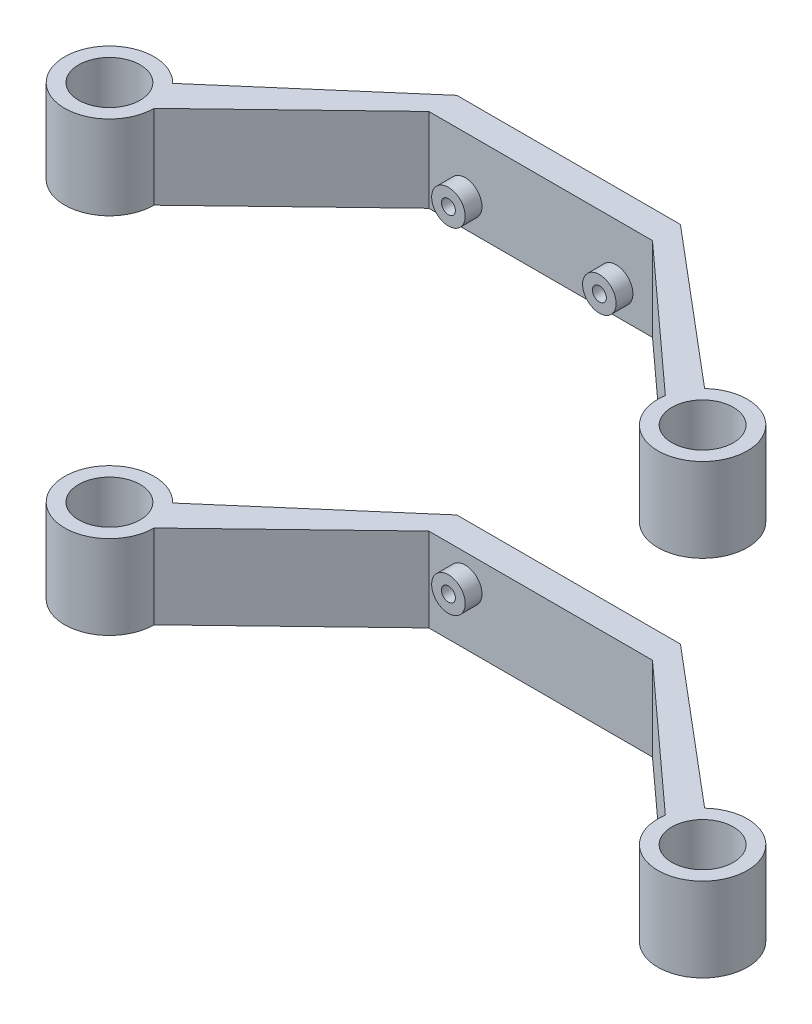
ISO-10303-21;
HEADER;
FILE_DESCRIPTION(('STEP AP214'),'2;1');
FILE_NAME('part.step','',(''),(''),'','','');
FILE_SCHEMA(('AUTOMOTIVE_DESIGN { 1 0 10303 214 1 1 1 1 }'));
ENDSEC;
DATA;
#1=APPLICATION_CONTEXT('core data for automotive mechanical design processes');
#2=APPLICATION_PROTOCOL_DEFINITION('international standard','automotive_design',2000,#1);
#3=PRODUCT_CONTEXT('',#1,'mechanical');
#4=PRODUCT('Part','Part','',(#3));
#5=PRODUCT_RELATED_PRODUCT_CATEGORY('part','',(#4));
#6=PRODUCT_DEFINITION_FORMATION('','',#4);
#7=PRODUCT_DEFINITION_CONTEXT('part definition',#1,'design');
#8=PRODUCT_DEFINITION('design','',#6,#7);
#9=PRODUCT_DEFINITION_SHAPE('','',#8);
#10=(LENGTH_UNIT() NAMED_UNIT(*) SI_UNIT(.MILLI.,.METRE.));
#11=(NAMED_UNIT(*) PLANE_ANGLE_UNIT() SI_UNIT($,.RADIAN.));
#12=(NAMED_UNIT(*) SI_UNIT($,.STERADIAN.) SOLID_ANGLE_UNIT());
#13=UNCERTAINTY_MEASURE_WITH_UNIT(LENGTH_MEASURE(1.E-05),#10,'distance_accuracy_value','');
#14=(GEOMETRIC_REPRESENTATION_CONTEXT(3) GLOBAL_UNCERTAINTY_ASSIGNED_CONTEXT((#13)) GLOBAL_UNIT_ASSIGNED_CONTEXT((#10,
#11,#12)) REPRESENTATION_CONTEXT('',''));
#15=CARTESIAN_POINT('',(0.,0.,0.));
#16=DIRECTION('',(0.,0.,1.));
#17=DIRECTION('',(1.,0.,0.));
#18=AXIS2_PLACEMENT_3D('',#15,#16,#17);
#19=CARTESIAN_POINT('',(0.,0.,0.));
#20=DIRECTION('',(0.,0.,1.));
#21=DIRECTION('',(1.,0.,0.));
#22=AXIS2_PLACEMENT_3D('',#19,#20,#21);
#23=PLANE('',#22);
#24=DIRECTION('',(0.,-1.,0.));
#25=VECTOR('',#24,1.);
#26=CARTESIAN_POINT('',(40.,0.,0.));
#27=LINE('',#26,#25);
#28=CARTESIAN_POINT('',(40.,0.,0.));
#29=VERTEX_POINT('',#28);
#30=CARTESIAN_POINT('',(40.,-15.,0.));
#31=VERTEX_POINT('',#30);
#32=EDGE_CURVE('E166',#29,#31,#27,.T.);
#33=ORIENTED_EDGE('',*,*,#32,.T.);
#34=DIRECTION('',(-1.,0.,0.));
#35=VECTOR('',#34,1.);
#36=CARTESIAN_POINT('',(-7.2392071826536,-15.,0.));
#37=LINE('',#36,#35);
#38=CARTESIAN_POINT('',(0.,-15.,0.));
#39=VERTEX_POINT('',#38);
#40=EDGE_CURVE('E90',#31,#39,#37,.T.);
#41=ORIENTED_EDGE('',*,*,#40,.T.);
#42=DIRECTION('',(0.,-1.,0.));
#43=VECTOR('',#42,1.);
#44=CARTESIAN_POINT('',(0.,0.,0.));
#45=LINE('',#44,#43);
#46=CARTESIAN_POINT('',(0.,0.,0.));
#47=VERTEX_POINT('',#46);
#48=EDGE_CURVE('E238',#47,#39,#45,.T.);
#49=ORIENTED_EDGE('',*,*,#48,.F.);
#50=DIRECTION('',(1.,0.,0.));
#51=VECTOR('',#50,1.);
#52=CARTESIAN_POINT('',(0.,0.,0.));
#53=LINE('',#52,#51);
#54=EDGE_CURVE('E224',#47,#29,#53,.T.);
#55=ORIENTED_EDGE('',*,*,#54,.T.);
#56=EDGE_LOOP('',(#33,#41,#49,#55));
#57=FACE_BOUND('',#56,.T.);
#58=ADVANCED_FACE('F87',(#57),#23,.F.);
#59=CARTESIAN_POINT('',(0.,-15.,0.));
#60=DIRECTION('',(0.,1.,0.));
#61=DIRECTION('',(0.,0.,1.));
#62=AXIS2_PLACEMENT_3D('',#59,#60,#61);
#63=PLANE('',#62);
#64=DIRECTION('',(-1.,0.,0.));
#65=VECTOR('',#64,1.);
#66=CARTESIAN_POINT('',(0.,-15.,5.00000000000001));
#67=LINE('',#66,#65);
#68=CARTESIAN_POINT('',(40.,-15.,5.));
#69=VERTEX_POINT('',#68);
#70=CARTESIAN_POINT('',(0.,-15.,5.00000000000002));
#71=VERTEX_POINT('',#70);
#72=EDGE_CURVE('E214',#69,#71,#67,.T.);
#73=ORIENTED_EDGE('',*,*,#72,.T.);
#74=DIRECTION('',(0.720883739402727,0.,-0.693056010914516));
#75=VECTOR('',#74,1.);
#76=CARTESIAN_POINT('',(2.49806404381797,-15.,2.5983668286763));
#77=LINE('',#76,#75);
#78=CARTESIAN_POINT('',(-25.05,-15.,29.0830138404742));
#79=VERTEX_POINT('',#78);
#80=EDGE_CURVE('E225',#79,#71,#77,.T.);
#81=ORIENTED_EDGE('',*,*,#80,.F.);
#82=CARTESIAN_POINT('',(-33.05,-15.,29.0830138404742));
#83=DIRECTION('',(0.,1.,0.));
#84=DIRECTION('',(0.,0.,1.));
#85=AXIS2_PLACEMENT_3D('',#82,#83,#84);
#86=CIRCLE('',#85,7.99999999999999);
#87=CARTESIAN_POINT('',(-27.2638611079006,-15.,23.5584689070579));
#88=VERTEX_POINT('',#87);
#89=EDGE_CURVE('E231',#88,#79,#86,.T.);
#90=ORIENTED_EDGE('',*,*,#89,.F.);
#91=DIRECTION('',(-0.756652649778043,0.,0.653817075017061));
#92=VECTOR('',#91,1.);
#93=CARTESIAN_POINT('',(0.,-15.,0.));
#94=LINE('',#93,#92);
#95=EDGE_CURVE('E236',#39,#88,#94,.T.);
#96=ORIENTED_EDGE('',*,*,#95,.F.);
#97=ORIENTED_EDGE('',*,*,#40,.F.);
#98=DIRECTION('',(-0.764521282063486,0.,-0.644598486867603));
#99=VECTOR('',#98,1.);
#100=CARTESIAN_POINT('',(16.6202883708801,-15.,-19.7123704638481));
#101=LINE('',#100,#99);
#102=CARTESIAN_POINT('',(67.5752167610798,-15.,23.2497687327456));
#103=VERTEX_POINT('',#102);
#104=EDGE_CURVE('E161',#103,#31,#101,.T.);
#105=ORIENTED_EDGE('',*,*,#104,.F.);
#106=CARTESIAN_POINT('',(73.05,-15.,29.0830138404742));
#107=DIRECTION('',(0.,1.,0.));
#108=DIRECTION('',(0.,0.,1.));
#109=AXIS2_PLACEMENT_3D('',#106,#107,#108);
#110=CIRCLE('',#109,8.00000000000001);
#111=CARTESIAN_POINT('',(65.1461266020736,-15.,27.8465732597946));
#112=VERTEX_POINT('',#111);
#113=EDGE_CURVE('E157',#112,#103,#110,.T.);
#114=ORIENTED_EDGE('',*,*,#113,.F.);
#115=DIRECTION('',(0.740138431190022,0.,0.672454535768459));
#116=VECTOR('',#115,1.);
#117=CARTESIAN_POINT('',(15.5992568812715,-15.,-17.1693533193891));
#118=LINE('',#117,#116);
#119=EDGE_CURVE('E218',#69,#112,#118,.T.);
#120=ORIENTED_EDGE('',*,*,#119,.F.);
#121=EDGE_LOOP('',(#73,#81,#90,#96,#97,#105,#114,#120));
#122=FACE_BOUND('',#121,.T.);
#123=CARTESIAN_POINT('',(73.05,-15.,29.0830138404742));
#124=DIRECTION('',(0.,1.,0.));
#125=DIRECTION('',(0.,0.,1.));
#126=AXIS2_PLACEMENT_3D('',#123,#124,#125);
#127=CIRCLE('',#126,5.5);
#128=CARTESIAN_POINT('',(73.05,-15.,34.5830138404742));
#129=VERTEX_POINT('',#128);
#130=EDGE_CURVE('E206',#129,#129,#127,.T.);
#131=ORIENTED_EDGE('',*,*,#130,.T.);
#132=EDGE_LOOP('',(#131));
#133=FACE_BOUND('',#132,.T.);
#134=CARTESIAN_POINT('',(-33.05,-15.,29.0830138404742));
#135=DIRECTION('',(0.,1.,0.));
#136=DIRECTION('',(0.,0.,1.));
#137=AXIS2_PLACEMENT_3D('',#134,#135,#136);
#138=CIRCLE('',#137,5.5);
#139=CARTESIAN_POINT('',(-33.05,-15.,34.5830138404742));
#140=VERTEX_POINT('',#139);
#141=EDGE_CURVE('E204',#140,#140,#138,.T.);
#142=ORIENTED_EDGE('',*,*,#141,.T.);
#143=EDGE_LOOP('',(#142));
#144=FACE_BOUND('',#143,.T.);
#145=ADVANCED_FACE('F242',(#122,#133,#144),#63,.F.);
#146=CARTESIAN_POINT('',(0.,0.,3.));
#147=DIRECTION('',(0.,1.,0.));
#148=DIRECTION('',(0.,0.,1.));
#149=AXIS2_PLACEMENT_3D('',#146,#147,#148);
#150=PLANE('',#149);
#151=ORIENTED_EDGE('',*,*,#54,.F.);
#152=DIRECTION('',(-0.756652649778043,0.,0.653817075017061));
#153=VECTOR('',#152,1.);
#154=CARTESIAN_POINT('',(0.,0.,0.));
#155=LINE('',#154,#153);
#156=CARTESIAN_POINT('',(-27.2638611079006,0.,23.5584689070579));
#157=VERTEX_POINT('',#156);
#158=EDGE_CURVE('E201',#47,#157,#155,.T.);
#159=ORIENTED_EDGE('',*,*,#158,.T.);
#160=CARTESIAN_POINT('',(-33.05,0.,29.0830138404742));
#161=DIRECTION('',(0.,1.,0.));
#162=DIRECTION('',(0.,0.,1.));
#163=AXIS2_PLACEMENT_3D('',#160,#161,#162);
#164=CIRCLE('',#163,7.99999999999999);
#165=CARTESIAN_POINT('',(-25.05,0.,29.0830138404742));
#166=VERTEX_POINT('',#165);
#167=EDGE_CURVE('E197',#157,#166,#164,.T.);
#168=ORIENTED_EDGE('',*,*,#167,.T.);
#169=DIRECTION('',(0.720883739402727,0.,-0.693056010914516));
#170=VECTOR('',#169,1.);
#171=CARTESIAN_POINT('',(2.49806404381797,0.,2.5983668286763));
#172=LINE('',#171,#170);
#173=CARTESIAN_POINT('',(0.,0.,5.00000000000002));
#174=VERTEX_POINT('',#173);
#175=EDGE_CURVE('E182',#166,#174,#172,.T.);
#176=ORIENTED_EDGE('',*,*,#175,.T.);
#177=DIRECTION('',(-1.,0.,0.));
#178=VECTOR('',#177,1.);
#179=CARTESIAN_POINT('',(0.,0.,5.00000000000001));
#180=LINE('',#179,#178);
#181=CARTESIAN_POINT('',(40.,0.,5.));
#182=VERTEX_POINT('',#181);
#183=EDGE_CURVE('E188',#182,#174,#180,.T.);
#184=ORIENTED_EDGE('',*,*,#183,.F.);
#185=DIRECTION('',(0.740138431190022,0.,0.672454535768459));
#186=VECTOR('',#185,1.);
#187=CARTESIAN_POINT('',(15.5992568812715,0.,-17.1693533193891));
#188=LINE('',#187,#186);
#189=CARTESIAN_POINT('',(65.1461266020736,0.,27.8465732597946));
#190=VERTEX_POINT('',#189);
#191=EDGE_CURVE('E178',#182,#190,#188,.T.);
#192=ORIENTED_EDGE('',*,*,#191,.T.);
#193=CARTESIAN_POINT('',(73.05,0.,29.0830138404742));
#194=DIRECTION('',(0.,1.,0.));
#195=DIRECTION('',(0.,0.,1.));
#196=AXIS2_PLACEMENT_3D('',#193,#194,#195);
#197=CIRCLE('',#196,8.00000000000001);
#198=CARTESIAN_POINT('',(67.5752167610798,0.,23.2497687327456));
#199=VERTEX_POINT('',#198);
#200=EDGE_CURVE('E155',#190,#199,#197,.T.);
#201=ORIENTED_EDGE('',*,*,#200,.T.);
#202=DIRECTION('',(-0.764521282063486,0.,-0.644598486867603));
#203=VECTOR('',#202,1.);
#204=CARTESIAN_POINT('',(16.6202883708801,0.,-19.7123704638481));
#205=LINE('',#204,#203);
#206=EDGE_CURVE('E164',#199,#29,#205,.T.);
#207=ORIENTED_EDGE('',*,*,#206,.T.);
#208=EDGE_LOOP('',(#151,#159,#168,#176,#184,#192,#201,#207));
#209=FACE_BOUND('',#208,.T.);
#210=CARTESIAN_POINT('',(73.05,0.,29.0830138404742));
#211=DIRECTION('',(0.,1.,0.));
#212=DIRECTION('',(0.,0.,1.));
#213=AXIS2_PLACEMENT_3D('',#210,#211,#212);
#214=CIRCLE('',#213,5.5);
#215=CARTESIAN_POINT('',(73.05,0.,34.5830138404742));
#216=VERTEX_POINT('',#215);
#217=EDGE_CURVE('E171',#216,#216,#214,.T.);
#218=ORIENTED_EDGE('',*,*,#217,.F.);
#219=EDGE_LOOP('',(#218));
#220=FACE_BOUND('',#219,.T.);
#221=CARTESIAN_POINT('',(-33.05,0.,29.0830138404742));
#222=DIRECTION('',(0.,1.,0.));
#223=DIRECTION('',(0.,0.,1.));
#224=AXIS2_PLACEMENT_3D('',#221,#222,#223);
#225=CIRCLE('',#224,5.5);
#226=CARTESIAN_POINT('',(-33.05,0.,34.5830138404742));
#227=VERTEX_POINT('',#226);
#228=EDGE_CURVE('E185',#227,#227,#225,.T.);
#229=ORIENTED_EDGE('',*,*,#228,.F.);
#230=EDGE_LOOP('',(#229));
#231=FACE_BOUND('',#230,.T.);
#232=ADVANCED_FACE('F174',(#209,#220,#231),#150,.T.);
#233=CARTESIAN_POINT('',(73.05,-15.,29.0830138404742));
#234=DIRECTION('',(0.,1.,0.));
#235=DIRECTION('',(0.,0.,1.));
#236=AXIS2_PLACEMENT_3D('',#233,#234,#235);
#237=CYLINDRICAL_SURFACE('',#236,5.5);
#238=ORIENTED_EDGE('',*,*,#130,.F.);
#239=EDGE_LOOP('',(#238));
#240=FACE_BOUND('',#239,.T.);
#241=ORIENTED_EDGE('',*,*,#217,.T.);
#242=EDGE_LOOP('',(#241));
#243=FACE_BOUND('',#242,.T.);
#244=ADVANCED_FACE('F326',(#240,#243),#237,.F.);
#245=CARTESIAN_POINT('',(-33.05,-15.,29.0830138404742));
#246=DIRECTION('',(0.,1.,0.));
#247=DIRECTION('',(0.,0.,1.));
#248=AXIS2_PLACEMENT_3D('',#245,#246,#247);
#249=CYLINDRICAL_SURFACE('',#248,5.5);
#250=ORIENTED_EDGE('',*,*,#141,.F.);
#251=EDGE_LOOP('',(#250));
#252=FACE_BOUND('',#251,.T.);
#253=ORIENTED_EDGE('',*,*,#228,.T.);
#254=EDGE_LOOP('',(#253));
#255=FACE_BOUND('',#254,.T.);
#256=ADVANCED_FACE('F331',(#252,#255),#249,.F.);
#257=CARTESIAN_POINT('',(0.,-15.,0.));
#258=DIRECTION('',(-0.653817075017061,0.,-0.756652649778043));
#259=DIRECTION('',(-0.756652649778043,0.,0.653817075017061));
#260=AXIS2_PLACEMENT_3D('',#257,#258,#259);
#261=PLANE('',#260);
#262=ORIENTED_EDGE('',*,*,#158,.F.);
#263=ORIENTED_EDGE('',*,*,#48,.T.);
#264=ORIENTED_EDGE('',*,*,#95,.T.);
#265=DIRECTION('',(0.,1.,0.));
#266=VECTOR('',#265,1.);
#267=CARTESIAN_POINT('',(-27.2638611079006,-15.,23.5584689070579));
#268=LINE('',#267,#266);
#269=EDGE_CURVE('E235',#88,#157,#268,.T.);
#270=ORIENTED_EDGE('',*,*,#269,.T.);
#271=EDGE_LOOP('',(#262,#263,#264,#270));
#272=FACE_BOUND('',#271,.T.);
#273=ADVANCED_FACE('F335',(#272),#261,.T.);
#274=CARTESIAN_POINT('',(-33.05,-15.,29.0830138404742));
#275=DIRECTION('',(0.,1.,0.));
#276=DIRECTION('',(0.,0.,1.));
#277=AXIS2_PLACEMENT_3D('',#274,#275,#276);
#278=CYLINDRICAL_SURFACE('',#277,7.99999999999999);
#279=ORIENTED_EDGE('',*,*,#167,.F.);
#280=ORIENTED_EDGE('',*,*,#269,.F.);
#281=ORIENTED_EDGE('',*,*,#89,.T.);
#282=DIRECTION('',(0.,1.,0.));
#283=VECTOR('',#282,1.);
#284=CARTESIAN_POINT('',(-25.05,-15.,29.0830138404742));
#285=LINE('',#284,#283);
#286=EDGE_CURVE('E230',#79,#166,#285,.T.);
#287=ORIENTED_EDGE('',*,*,#286,.T.);
#288=EDGE_LOOP('',(#279,#280,#281,#287));
#289=FACE_BOUND('',#288,.T.);
#290=ADVANCED_FACE('F348',(#289),#278,.T.);
#291=CARTESIAN_POINT('',(2.49806404381797,-15.,2.5983668286763));
#292=DIRECTION('',(0.693056010914516,0.,0.720883739402727));
#293=DIRECTION('',(0.720883739402727,0.,-0.693056010914516));
#294=AXIS2_PLACEMENT_3D('',#291,#292,#293);
#295=PLANE('',#294);
#296=ORIENTED_EDGE('',*,*,#175,.F.);
#297=ORIENTED_EDGE('',*,*,#286,.F.);
#298=ORIENTED_EDGE('',*,*,#80,.T.);
#299=DIRECTION('',(0.,1.,0.));
#300=VECTOR('',#299,1.);
#301=CARTESIAN_POINT('',(0.,-15.,5.00000000000002));
#302=LINE('',#301,#300);
#303=EDGE_CURVE('E229',#71,#174,#302,.T.);
#304=ORIENTED_EDGE('',*,*,#303,.T.);
#305=EDGE_LOOP('',(#296,#297,#298,#304));
#306=FACE_BOUND('',#305,.T.);
#307=ADVANCED_FACE('F344',(#306),#295,.T.);
#308=CARTESIAN_POINT('',(0.,-15.,5.00000000000001));
#309=DIRECTION('',(0.,0.,-1.));
#310=DIRECTION('',(-1.,0.,0.));
#311=AXIS2_PLACEMENT_3D('',#308,#309,#310);
#312=PLANE('',#311);
#313=CARTESIAN_POINT('',(6.5,-10.,5.00000000000001));
#314=DIRECTION('',(0.,0.,-1.));
#315=DIRECTION('',(-1.,0.,0.));
#316=AXIS2_PLACEMENT_3D('',#313,#314,#315);
#317=CIRCLE('',#316,3.);
#318=CARTESIAN_POINT('',(3.5,-10.,5.00000000000001));
#319=VERTEX_POINT('',#318);
#320=EDGE_CURVE('E266',#319,#319,#317,.T.);
#321=ORIENTED_EDGE('',*,*,#320,.T.);
#322=EDGE_LOOP('',(#321));
#323=FACE_BOUND('',#322,.T.);
#324=CARTESIAN_POINT('',(33.5,-10.,5.00000000000001));
#325=DIRECTION('',(0.,0.,-1.));
#326=DIRECTION('',(-1.,0.,0.));
#327=AXIS2_PLACEMENT_3D('',#324,#325,#326);
#328=CIRCLE('',#327,3.);
#329=CARTESIAN_POINT('',(30.5,-10.,5.00000000000001));
#330=VERTEX_POINT('',#329);
#331=EDGE_CURVE('E193',#330,#330,#328,.T.);
#332=ORIENTED_EDGE('',*,*,#331,.T.);
#333=EDGE_LOOP('',(#332));
#334=FACE_BOUND('',#333,.T.);
#335=ORIENTED_EDGE('',*,*,#183,.T.);
#336=ORIENTED_EDGE('',*,*,#303,.F.);
#337=ORIENTED_EDGE('',*,*,#72,.F.);
#338=DIRECTION('',(0.,1.,0.));
#339=VECTOR('',#338,1.);
#340=CARTESIAN_POINT('',(40.,-15.,5.));
#341=LINE('',#340,#339);
#342=EDGE_CURVE('E192',#69,#182,#341,.T.);
#343=ORIENTED_EDGE('',*,*,#342,.T.);
#344=EDGE_LOOP('',(#335,#336,#337,#343));
#345=FACE_BOUND('',#344,.T.);
#346=ADVANCED_FACE('F297',(#323,#334,#345),#312,.F.);
#347=CARTESIAN_POINT('',(15.5992568812715,-15.,-17.1693533193891));
#348=DIRECTION('',(-0.672454535768459,0.,0.740138431190022));
#349=DIRECTION('',(0.740138431190022,0.,0.672454535768459));
#350=AXIS2_PLACEMENT_3D('',#347,#348,#349);
#351=PLANE('',#350);
#352=ORIENTED_EDGE('',*,*,#191,.F.);
#353=ORIENTED_EDGE('',*,*,#342,.F.);
#354=ORIENTED_EDGE('',*,*,#119,.T.);
#355=DIRECTION('',(0.,1.,0.));
#356=VECTOR('',#355,1.);
#357=CARTESIAN_POINT('',(65.1461266020736,-15.,27.8465732597946));
#358=LINE('',#357,#356);
#359=EDGE_CURVE('E217',#112,#190,#358,.T.);
#360=ORIENTED_EDGE('',*,*,#359,.T.);
#361=EDGE_LOOP('',(#352,#353,#354,#360));
#362=FACE_BOUND('',#361,.T.);
#363=ADVANCED_FACE('F339',(#362),#351,.T.);
#364=CARTESIAN_POINT('',(73.05,-15.,29.0830138404742));
#365=DIRECTION('',(0.,1.,0.));
#366=DIRECTION('',(0.,0.,1.));
#367=AXIS2_PLACEMENT_3D('',#364,#365,#366);
#368=CYLINDRICAL_SURFACE('',#367,8.00000000000001);
#369=ORIENTED_EDGE('',*,*,#200,.F.);
#370=ORIENTED_EDGE('',*,*,#359,.F.);
#371=ORIENTED_EDGE('',*,*,#113,.T.);
#372=DIRECTION('',(0.,1.,0.));
#373=VECTOR('',#372,1.);
#374=CARTESIAN_POINT('',(67.5752167610798,-15.,23.2497687327456));
#375=LINE('',#374,#373);
#376=EDGE_CURVE('E151',#103,#199,#375,.T.);
#377=ORIENTED_EDGE('',*,*,#376,.T.);
#378=EDGE_LOOP('',(#369,#370,#371,#377));
#379=FACE_BOUND('',#378,.T.);
#380=ADVANCED_FACE('F153',(#379),#368,.T.);
#381=CARTESIAN_POINT('',(16.6202883708801,-15.,-19.7123704638481));
#382=DIRECTION('',(0.644598486867603,0.,-0.764521282063486));
#383=DIRECTION('',(-0.764521282063486,0.,-0.644598486867603));
#384=AXIS2_PLACEMENT_3D('',#381,#382,#383);
#385=PLANE('',#384);
#386=ORIENTED_EDGE('',*,*,#206,.F.);
#387=ORIENTED_EDGE('',*,*,#376,.F.);
#388=ORIENTED_EDGE('',*,*,#104,.T.);
#389=ORIENTED_EDGE('',*,*,#32,.F.);
#390=EDGE_LOOP('',(#386,#387,#388,#389));
#391=FACE_BOUND('',#390,.T.);
#392=ADVANCED_FACE('F165',(#391),#385,.T.);
#393=CARTESIAN_POINT('',(33.5,-10.,8.));
#394=DIRECTION('',(0.,0.,-1.));
#395=DIRECTION('',(-1.,0.,0.));
#396=AXIS2_PLACEMENT_3D('',#393,#394,#395);
#397=CYLINDRICAL_SURFACE('',#396,1.25);
#398=CARTESIAN_POINT('',(33.5,-10.,8.));
#399=DIRECTION('',(0.,0.,1.));
#400=DIRECTION('',(1.,0.,0.));
#401=AXIS2_PLACEMENT_3D('',#398,#399,#400);
#402=CIRCLE('',#401,1.25);
#403=CARTESIAN_POINT('',(34.75,-10.,8.));
#404=VERTEX_POINT('',#403);
#405=EDGE_CURVE('E210',#404,#404,#402,.T.);
#406=ORIENTED_EDGE('',*,*,#405,.T.);
#407=EDGE_LOOP('',(#406));
#408=FACE_BOUND('',#407,.T.);
#409=CARTESIAN_POINT('',(33.5,-10.,5.00000000000001));
#410=DIRECTION('',(0.,0.,-1.));
#411=DIRECTION('',(-1.,0.,0.));
#412=AXIS2_PLACEMENT_3D('',#409,#410,#411);
#413=CIRCLE('',#412,1.25);
#414=CARTESIAN_POINT('',(32.25,-10.,5.00000000000001));
#415=VERTEX_POINT('',#414);
#416=EDGE_CURVE('E259',#415,#415,#413,.T.);
#417=ORIENTED_EDGE('',*,*,#416,.T.);
#418=EDGE_LOOP('',(#417));
#419=FACE_BOUND('',#418,.T.);
#420=ADVANCED_FACE('F314',(#408,#419),#397,.F.);
#421=CARTESIAN_POINT('',(0.,0.,8.));
#422=DIRECTION('',(0.,0.,1.));
#423=DIRECTION('',(1.,0.,0.));
#424=AXIS2_PLACEMENT_3D('',#421,#422,#423);
#425=PLANE('',#424);
#426=ORIENTED_EDGE('',*,*,#405,.F.);
#427=EDGE_LOOP('',(#426));
#428=FACE_BOUND('',#427,.T.);
#429=CARTESIAN_POINT('',(33.5,-10.,8.));
#430=DIRECTION('',(0.,0.,1.));
#431=DIRECTION('',(1.,0.,0.));
#432=AXIS2_PLACEMENT_3D('',#429,#430,#431);
#433=CIRCLE('',#432,3.);
#434=CARTESIAN_POINT('',(36.5,-10.,8.));
#435=VERTEX_POINT('',#434);
#436=EDGE_CURVE('E255',#435,#435,#433,.T.);
#437=ORIENTED_EDGE('',*,*,#436,.T.);
#438=EDGE_LOOP('',(#437));
#439=FACE_BOUND('',#438,.T.);
#440=ADVANCED_FACE('F303',(#428,#439),#425,.T.);
#441=CARTESIAN_POINT('',(33.5,-10.,8.));
#442=DIRECTION('',(0.,0.,-1.));
#443=DIRECTION('',(-1.,0.,0.));
#444=AXIS2_PLACEMENT_3D('',#441,#442,#443);
#445=CYLINDRICAL_SURFACE('',#444,3.);
#446=ORIENTED_EDGE('',*,*,#436,.F.);
#447=EDGE_LOOP('',(#446));
#448=FACE_BOUND('',#447,.T.);
#449=ORIENTED_EDGE('',*,*,#331,.F.);
#450=EDGE_LOOP('',(#449));
#451=FACE_BOUND('',#450,.T.);
#452=ADVANCED_FACE('F300',(#448,#451),#445,.T.);
#453=ORIENTED_EDGE('',*,*,#416,.F.);
#454=EDGE_LOOP('',(#453));
#455=FACE_BOUND('',#454,.T.);
#456=ADVANCED_FACE('F302',(#455),#312,.F.);
#457=CARTESIAN_POINT('',(6.5,-10.,8.));
#458=DIRECTION('',(0.,0.,-1.));
#459=DIRECTION('',(-1.,0.,0.));
#460=AXIS2_PLACEMENT_3D('',#457,#458,#459);
#461=CYLINDRICAL_SURFACE('',#460,1.25);
#462=CARTESIAN_POINT('',(6.5,-10.,8.));
#463=DIRECTION('',(0.,0.,1.));
#464=DIRECTION('',(1.,0.,0.));
#465=AXIS2_PLACEMENT_3D('',#462,#463,#464);
#466=CIRCLE('',#465,1.25);
#467=CARTESIAN_POINT('',(7.75,-10.,8.));
#468=VERTEX_POINT('',#467);
#469=EDGE_CURVE('E251',#468,#468,#466,.T.);
#470=ORIENTED_EDGE('',*,*,#469,.T.);
#471=EDGE_LOOP('',(#470));
#472=FACE_BOUND('',#471,.T.);
#473=CARTESIAN_POINT('',(6.5,-10.,5.00000000000001));
#474=DIRECTION('',(0.,0.,-1.));
#475=DIRECTION('',(-1.,0.,0.));
#476=AXIS2_PLACEMENT_3D('',#473,#474,#475);
#477=CIRCLE('',#476,1.25);
#478=CARTESIAN_POINT('',(5.25,-10.,5.00000000000001));
#479=VERTEX_POINT('',#478);
#480=EDGE_CURVE('E97',#479,#479,#477,.T.);
#481=ORIENTED_EDGE('',*,*,#480,.T.);
#482=EDGE_LOOP('',(#481));
#483=FACE_BOUND('',#482,.T.);
#484=ADVANCED_FACE('F310',(#472,#483),#461,.F.);
#485=CARTESIAN_POINT('',(0.,0.,8.));
#486=DIRECTION('',(0.,0.,1.));
#487=DIRECTION('',(1.,0.,0.));
#488=AXIS2_PLACEMENT_3D('',#485,#486,#487);
#489=PLANE('',#488);
#490=ORIENTED_EDGE('',*,*,#469,.F.);
#491=EDGE_LOOP('',(#490));
#492=FACE_BOUND('',#491,.T.);
#493=CARTESIAN_POINT('',(6.5,-10.,8.));
#494=DIRECTION('',(0.,0.,1.));
#495=DIRECTION('',(1.,0.,0.));
#496=AXIS2_PLACEMENT_3D('',#493,#494,#495);
#497=CIRCLE('',#496,3.);
#498=CARTESIAN_POINT('',(9.5,-10.,8.));
#499=VERTEX_POINT('',#498);
#500=EDGE_CURVE('E13',#499,#499,#497,.T.);
#501=ORIENTED_EDGE('',*,*,#500,.T.);
#502=EDGE_LOOP('',(#501));
#503=FACE_BOUND('',#502,.T.);
#504=ADVANCED_FACE('F364',(#492,#503),#489,.T.);
#505=CARTESIAN_POINT('',(6.5,-10.,8.));
#506=DIRECTION('',(0.,0.,-1.));
#507=DIRECTION('',(-1.,0.,0.));
#508=AXIS2_PLACEMENT_3D('',#505,#506,#507);
#509=CYLINDRICAL_SURFACE('',#508,3.);
#510=ORIENTED_EDGE('',*,*,#500,.F.);
#511=EDGE_LOOP('',(#510));
#512=FACE_BOUND('',#511,.T.);
#513=ORIENTED_EDGE('',*,*,#320,.F.);
#514=EDGE_LOOP('',(#513));
#515=FACE_BOUND('',#514,.T.);
#516=ADVANCED_FACE('F367',(#512,#515),#509,.T.);
#517=ORIENTED_EDGE('',*,*,#480,.F.);
#518=EDGE_LOOP('',(#517));
#519=FACE_BOUND('',#518,.T.);
#520=ADVANCED_FACE('F313',(#519),#312,.F.);
#521=CLOSED_SHELL('',(#58,#145,#232,#244,#256,#273,#290,#307,#346,#363,#380,#392,#420,#440,#452,
#456,#484,#504,#516,#520));
#522=MANIFOLD_SOLID_BREP('B2',#521);
#523=CARTESIAN_POINT('',(0.,-80.,5.00000000000001));
#524=DIRECTION('',(0.,0.,-1.));
#525=DIRECTION('',(-1.,0.,0.));
#526=AXIS2_PLACEMENT_3D('',#523,#524,#525);
#527=PLANE('',#526);
#528=CARTESIAN_POINT('',(6.50000000000063,-70.,5.00000000000001));
#529=DIRECTION('',(0.,0.,-1.));
#530=DIRECTION('',(-1.,0.,0.));
#531=AXIS2_PLACEMENT_3D('',#528,#529,#530);
#532=CIRCLE('',#531,1.25);
#533=CARTESIAN_POINT('',(5.25000000000062,-70.,5.00000000000001));
#534=VERTEX_POINT('',#533);
#535=EDGE_CURVE('E643',#534,#534,#532,.T.);
#536=ORIENTED_EDGE('',*,*,#535,.F.);
#537=EDGE_LOOP('',(#536));
#538=FACE_BOUND('',#537,.T.);
#539=ADVANCED_FACE('F535',(#538),#527,.F.);
#540=CARTESIAN_POINT('',(6.50000000000063,-70.,8.));
#541=DIRECTION('',(0.,0.,-1.));
#542=DIRECTION('',(-1.,0.,0.));
#543=AXIS2_PLACEMENT_3D('',#540,#541,#542);
#544=CYLINDRICAL_SURFACE('',#543,1.25);
#545=CARTESIAN_POINT('',(6.50000000000063,-70.,8.));
#546=DIRECTION('',(0.,0.,1.));
#547=DIRECTION('',(1.,0.,0.));
#548=AXIS2_PLACEMENT_3D('',#545,#546,#547);
#549=CIRCLE('',#548,1.25);
#550=CARTESIAN_POINT('',(7.75000000000063,-70.,8.));
#551=VERTEX_POINT('',#550);
#552=EDGE_CURVE('E657',#551,#551,#549,.T.);
#553=ORIENTED_EDGE('',*,*,#552,.T.);
#554=EDGE_LOOP('',(#553));
#555=FACE_BOUND('',#554,.T.);
#556=ORIENTED_EDGE('',*,*,#535,.T.);
#557=EDGE_LOOP('',(#556));
#558=FACE_BOUND('',#557,.T.);
#559=ADVANCED_FACE('F722',(#555,#558),#544,.F.);
#560=CARTESIAN_POINT('',(0.,0.,8.));
#561=DIRECTION('',(0.,0.,1.));
#562=DIRECTION('',(1.,0.,0.));
#563=AXIS2_PLACEMENT_3D('',#560,#561,#562);
#564=PLANE('',#563);
#565=ORIENTED_EDGE('',*,*,#552,.F.);
#566=EDGE_LOOP('',(#565));
#567=FACE_BOUND('',#566,.T.);
#568=CARTESIAN_POINT('',(6.50000000000063,-70.,8.));
#569=DIRECTION('',(0.,0.,1.));
#570=DIRECTION('',(1.,0.,0.));
#571=AXIS2_PLACEMENT_3D('',#568,#569,#570);
#572=CIRCLE('',#571,3.);
#573=CARTESIAN_POINT('',(9.50000000000063,-70.,8.));
#574=VERTEX_POINT('',#573);
#575=EDGE_CURVE('E660',#574,#574,#572,.T.);
#576=ORIENTED_EDGE('',*,*,#575,.T.);
#577=EDGE_LOOP('',(#576));
#578=FACE_BOUND('',#577,.T.);
#579=ADVANCED_FACE('F729',(#567,#578),#564,.T.);
#580=CARTESIAN_POINT('',(6.50000000000063,-70.,8.));
#581=DIRECTION('',(0.,0.,-1.));
#582=DIRECTION('',(-1.,0.,0.));
#583=AXIS2_PLACEMENT_3D('',#580,#581,#582);
#584=CYLINDRICAL_SURFACE('',#583,3.);
#585=ORIENTED_EDGE('',*,*,#575,.F.);
#586=EDGE_LOOP('',(#585));
#587=FACE_BOUND('',#586,.T.);
#588=CARTESIAN_POINT('',(6.50000000000063,-70.,5.00000000000001));
#589=DIRECTION('',(0.,0.,-1.));
#590=DIRECTION('',(-1.,0.,0.));
#591=AXIS2_PLACEMENT_3D('',#588,#589,#590);
#592=CIRCLE('',#591,3.);
#593=CARTESIAN_POINT('',(3.50000000000062,-70.,5.00000000000001));
#594=VERTEX_POINT('',#593);
#595=EDGE_CURVE('E85',#594,#594,#592,.T.);
#596=ORIENTED_EDGE('',*,*,#595,.F.);
#597=EDGE_LOOP('',(#596));
#598=FACE_BOUND('',#597,.T.);
#599=ADVANCED_FACE('F698',(#587,#598),#584,.T.);
#600=CARTESIAN_POINT('',(73.05,-80.,29.0830138404742));
#601=DIRECTION('',(0.,1.,0.));
#602=DIRECTION('',(0.,0.,1.));
#603=AXIS2_PLACEMENT_3D('',#600,#601,#602);
#604=CYLINDRICAL_SURFACE('',#603,5.5);
#605=CARTESIAN_POINT('',(73.05,-80.,29.0830138404742));
#606=DIRECTION('',(0.,1.,0.));
#607=DIRECTION('',(0.,0.,1.));
#608=AXIS2_PLACEMENT_3D('',#605,#606,#607);
#609=CIRCLE('',#608,5.5);
#610=CARTESIAN_POINT('',(73.05,-80.,34.5830138404742));
#611=VERTEX_POINT('',#610);
#612=EDGE_CURVE('E654',#611,#611,#609,.T.);
#613=ORIENTED_EDGE('',*,*,#612,.F.);
#614=EDGE_LOOP('',(#613));
#615=FACE_BOUND('',#614,.T.);
#616=CARTESIAN_POINT('',(73.05,-65.,29.0830138404742));
#617=DIRECTION('',(0.,1.,0.));
#618=DIRECTION('',(0.,0.,1.));
#619=AXIS2_PLACEMENT_3D('',#616,#617,#618);
#620=CIRCLE('',#619,5.5);
#621=CARTESIAN_POINT('',(73.05,-65.,34.5830138404742));
#622=VERTEX_POINT('',#621);
#623=EDGE_CURVE('E637',#622,#622,#620,.T.);
#624=ORIENTED_EDGE('',*,*,#623,.T.);
#625=EDGE_LOOP('',(#624));
#626=FACE_BOUND('',#625,.T.);
#627=ADVANCED_FACE('F694',(#615,#626),#604,.F.);
#628=CARTESIAN_POINT('',(-33.05,-80.,29.0830138404742));
#629=DIRECTION('',(0.,1.,0.));
#630=DIRECTION('',(0.,0.,1.));
#631=AXIS2_PLACEMENT_3D('',#628,#629,#630);
#632=CYLINDRICAL_SURFACE('',#631,5.5);
#633=CARTESIAN_POINT('',(-33.05,-80.,29.0830138404742));
#634=DIRECTION('',(0.,1.,0.));
#635=DIRECTION('',(0.,0.,1.));
#636=AXIS2_PLACEMENT_3D('',#633,#634,#635);
#637=CIRCLE('',#636,5.5);
#638=CARTESIAN_POINT('',(-33.05,-80.,34.5830138404742));
#639=VERTEX_POINT('',#638);
#640=EDGE_CURVE('E688',#639,#639,#637,.T.);
#641=ORIENTED_EDGE('',*,*,#640,.F.);
#642=EDGE_LOOP('',(#641));
#643=FACE_BOUND('',#642,.T.);
#644=CARTESIAN_POINT('',(-33.05,-65.,29.0830138404742));
#645=DIRECTION('',(0.,1.,0.));
#646=DIRECTION('',(0.,0.,1.));
#647=AXIS2_PLACEMENT_3D('',#644,#645,#646);
#648=CIRCLE('',#647,5.5);
#649=CARTESIAN_POINT('',(-33.05,-65.,34.5830138404742));
#650=VERTEX_POINT('',#649);
#651=EDGE_CURVE('E634',#650,#650,#648,.T.);
#652=ORIENTED_EDGE('',*,*,#651,.T.);
#653=EDGE_LOOP('',(#652));
#654=FACE_BOUND('',#653,.T.);
#655=ADVANCED_FACE('F697',(#643,#654),#632,.F.);
#656=CARTESIAN_POINT('',(2.49806404381798,-80.,2.5983668286763));
#657=DIRECTION('',(0.693056010914516,0.,0.720883739402727));
#658=DIRECTION('',(0.720883739402727,0.,-0.693056010914516));
#659=AXIS2_PLACEMENT_3D('',#656,#657,#658);
#660=PLANE('',#659);
#661=DIRECTION('',(0.720883739402727,0.,-0.693056010914516));
#662=VECTOR('',#661,1.);
#663=CARTESIAN_POINT('',(2.49806404381798,-65.,2.5983668286763));
#664=LINE('',#663,#662);
#665=CARTESIAN_POINT('',(-25.05,-65.,29.0830138404742));
#666=VERTEX_POINT('',#665);
#667=CARTESIAN_POINT('',(0.,-65.,5.00000000000002));
#668=VERTEX_POINT('',#667);
#669=EDGE_CURVE('E619',#666,#668,#664,.T.);
#670=ORIENTED_EDGE('',*,*,#669,.F.);
#671=DIRECTION('',(0.,1.,0.));
#672=VECTOR('',#671,1.);
#673=CARTESIAN_POINT('',(-25.05,-80.,29.0830138404742));
#674=LINE('',#673,#672);
#675=CARTESIAN_POINT('',(-25.05,-80.,29.0830138404742));
#676=VERTEX_POINT('',#675);
#677=EDGE_CURVE('E650',#676,#666,#674,.T.);
#678=ORIENTED_EDGE('',*,*,#677,.F.);
#679=DIRECTION('',(0.720883739402727,0.,-0.693056010914516));
#680=VECTOR('',#679,1.);
#681=CARTESIAN_POINT('',(2.49806404381798,-80.,2.5983668286763));
#682=LINE('',#681,#680);
#683=CARTESIAN_POINT('',(0.,-80.,5.00000000000002));
#684=VERTEX_POINT('',#683);
#685=EDGE_CURVE('E678',#676,#684,#682,.T.);
#686=ORIENTED_EDGE('',*,*,#685,.T.);
#687=DIRECTION('',(0.,1.,0.));
#688=VECTOR('',#687,1.);
#689=CARTESIAN_POINT('',(0.,-80.,5.00000000000002));
#690=LINE('',#689,#688);
#691=EDGE_CURVE('E648',#684,#668,#690,.T.);
#692=ORIENTED_EDGE('',*,*,#691,.T.);
#693=EDGE_LOOP('',(#670,#678,#686,#692));
#694=FACE_BOUND('',#693,.T.);
#695=ADVANCED_FACE('F709',(#694),#660,.T.);
#696=CARTESIAN_POINT('',(15.5992568812715,-80.,-17.1693533193891));
#697=DIRECTION('',(-0.672454535768459,0.,0.740138431190022));
#698=DIRECTION('',(0.740138431190022,0.,0.672454535768459));
#699=AXIS2_PLACEMENT_3D('',#696,#697,#698);
#700=PLANE('',#699);
#701=DIRECTION('',(0.740138431190022,0.,0.672454535768459));
#702=VECTOR('',#701,1.);
#703=CARTESIAN_POINT('',(15.5992568812715,-65.,-17.1693533193891));
#704=LINE('',#703,#702);
#705=CARTESIAN_POINT('',(40.,-65.,5.));
#706=VERTEX_POINT('',#705);
#707=CARTESIAN_POINT('',(65.1461266020736,-65.,27.8465732597946));
#708=VERTEX_POINT('',#707);
#709=EDGE_CURVE('E629',#706,#708,#704,.T.);
#710=ORIENTED_EDGE('',*,*,#709,.F.);
#711=DIRECTION('',(0.,1.,0.));
#712=VECTOR('',#711,1.);
#713=CARTESIAN_POINT('',(40.,-80.,5.));
#714=LINE('',#713,#712);
#715=CARTESIAN_POINT('',(40.,-80.,5.));
#716=VERTEX_POINT('',#715);
#717=EDGE_CURVE('E646',#716,#706,#714,.T.);
#718=ORIENTED_EDGE('',*,*,#717,.F.);
#719=DIRECTION('',(0.740138431190022,0.,0.672454535768459));
#720=VECTOR('',#719,1.);
#721=CARTESIAN_POINT('',(15.5992568812715,-80.,-17.1693533193891));
#722=LINE('',#721,#720);
#723=CARTESIAN_POINT('',(65.1461266020736,-80.,27.8465732597946));
#724=VERTEX_POINT('',#723);
#725=EDGE_CURVE('E683',#716,#724,#722,.T.);
#726=ORIENTED_EDGE('',*,*,#725,.T.);
#727=DIRECTION('',(0.,1.,0.));
#728=VECTOR('',#727,1.);
#729=CARTESIAN_POINT('',(65.1461266020736,-80.,27.8465732597946));
#730=LINE('',#729,#728);
#731=EDGE_CURVE('E644',#724,#708,#730,.T.);
#732=ORIENTED_EDGE('',*,*,#731,.T.);
#733=EDGE_LOOP('',(#710,#718,#726,#732));
#734=FACE_BOUND('',#733,.T.);
#735=ADVANCED_FACE('F716',(#734),#700,.T.);
#736=CARTESIAN_POINT('',(73.05,-80.,29.0830138404742));
#737=DIRECTION('',(0.,1.,0.));
#738=DIRECTION('',(0.,0.,1.));
#739=AXIS2_PLACEMENT_3D('',#736,#737,#738);
#740=CYLINDRICAL_SURFACE('',#739,8.00000000000001);
#741=CARTESIAN_POINT('',(73.05,-65.,29.0830138404742));
#742=DIRECTION('',(0.,1.,0.));
#743=DIRECTION('',(0.,0.,1.));
#744=AXIS2_PLACEMENT_3D('',#741,#742,#743);
#745=CIRCLE('',#744,8.00000000000001);
#746=CARTESIAN_POINT('',(67.5752167610799,-65.,23.2497687327456));
#747=VERTEX_POINT('',#746);
#748=EDGE_CURVE('E632',#708,#747,#745,.T.);
#749=ORIENTED_EDGE('',*,*,#748,.F.);
#750=ORIENTED_EDGE('',*,*,#731,.F.);
#751=CARTESIAN_POINT('',(73.05,-80.,29.0830138404742));
#752=DIRECTION('',(0.,1.,0.));
#753=DIRECTION('',(0.,0.,1.));
#754=AXIS2_PLACEMENT_3D('',#751,#752,#753);
#755=CIRCLE('',#754,8.00000000000001);
#756=CARTESIAN_POINT('',(67.5752167610799,-80.,23.2497687327456));
#757=VERTEX_POINT('',#756);
#758=EDGE_CURVE('E686',#724,#757,#755,.T.);
#759=ORIENTED_EDGE('',*,*,#758,.T.);
#760=DIRECTION('',(0.,1.,0.));
#761=VECTOR('',#760,1.);
#762=CARTESIAN_POINT('',(67.5752167610799,-80.,23.2497687327456));
#763=LINE('',#762,#761);
#764=EDGE_CURVE('E641',#757,#747,#763,.T.);
#765=ORIENTED_EDGE('',*,*,#764,.T.);
#766=EDGE_LOOP('',(#749,#750,#759,#765));
#767=FACE_BOUND('',#766,.T.);
#768=ADVANCED_FACE('F750',(#767),#740,.T.);
#769=CARTESIAN_POINT('',(-33.05,-80.,29.0830138404742));
#770=DIRECTION('',(0.,1.,0.));
#771=DIRECTION('',(0.,0.,1.));
#772=AXIS2_PLACEMENT_3D('',#769,#770,#771);
#773=CYLINDRICAL_SURFACE('',#772,7.99999999999999);
#774=CARTESIAN_POINT('',(-33.05,-65.,29.0830138404742));
#775=DIRECTION('',(0.,1.,0.));
#776=DIRECTION('',(0.,0.,1.));
#777=AXIS2_PLACEMENT_3D('',#774,#775,#776);
#778=CIRCLE('',#777,7.99999999999999);
#779=CARTESIAN_POINT('',(-27.2638611079006,-65.,23.5584689070579));
#780=VERTEX_POINT('',#779);
#781=EDGE_CURVE('E617',#780,#666,#778,.T.);
#782=ORIENTED_EDGE('',*,*,#781,.F.);
#783=DIRECTION('',(0.,1.,0.));
#784=VECTOR('',#783,1.);
#785=CARTESIAN_POINT('',(-27.2638611079006,-80.,23.5584689070579));
#786=LINE('',#785,#784);
#787=CARTESIAN_POINT('',(-27.2638611079006,-80.,23.5584689070579));
#788=VERTEX_POINT('',#787);
#789=EDGE_CURVE('E613',#788,#780,#786,.T.);
#790=ORIENTED_EDGE('',*,*,#789,.F.);
#791=CARTESIAN_POINT('',(-33.05,-80.,29.0830138404742));
#792=DIRECTION('',(0.,1.,0.));
#793=DIRECTION('',(0.,0.,1.));
#794=AXIS2_PLACEMENT_3D('',#791,#792,#793);
#795=CIRCLE('',#794,7.99999999999999);
#796=EDGE_CURVE('E673',#788,#676,#795,.T.);
#797=ORIENTED_EDGE('',*,*,#796,.T.);
#798=ORIENTED_EDGE('',*,*,#677,.T.);
#799=EDGE_LOOP('',(#782,#790,#797,#798));
#800=FACE_BOUND('',#799,.T.);
#801=ADVANCED_FACE('F704',(#800),#773,.T.);
#802=CARTESIAN_POINT('',(0.,-65.,0.));
#803=DIRECTION('',(0.,1.,0.));
#804=DIRECTION('',(0.,0.,1.));
#805=AXIS2_PLACEMENT_3D('',#802,#803,#804);
#806=PLANE('',#805);
#807=DIRECTION('',(-0.764521282063486,0.,-0.644598486867603));
#808=VECTOR('',#807,1.);
#809=CARTESIAN_POINT('',(16.6202883708801,-65.,-19.7123704638481));
#810=LINE('',#809,#808);
#811=CARTESIAN_POINT('',(40.,-65.,0.));
#812=VERTEX_POINT('',#811);
#813=EDGE_CURVE('E550',#747,#812,#810,.T.);
#814=ORIENTED_EDGE('',*,*,#813,.T.);
#815=DIRECTION('',(1.,0.,0.));
#816=VECTOR('',#815,1.);
#817=CARTESIAN_POINT('',(-7.2392071826536,-65.,0.));
#818=LINE('',#817,#816);
#819=CARTESIAN_POINT('',(0.,-65.,0.));
#820=VERTEX_POINT('',#819);
#821=EDGE_CURVE('E598',#820,#812,#818,.T.);
#822=ORIENTED_EDGE('',*,*,#821,.F.);
#823=DIRECTION('',(-0.756652649778043,0.,0.653817075017061));
#824=VECTOR('',#823,1.);
#825=CARTESIAN_POINT('',(0.,-65.,0.));
#826=LINE('',#825,#824);
#827=EDGE_CURVE('E604',#820,#780,#826,.T.);
#828=ORIENTED_EDGE('',*,*,#827,.T.);
#829=ORIENTED_EDGE('',*,*,#781,.T.);
#830=ORIENTED_EDGE('',*,*,#669,.T.);
#831=DIRECTION('',(-1.,0.,0.));
#832=VECTOR('',#831,1.);
#833=CARTESIAN_POINT('',(0.,-65.,5.00000000000001));
#834=LINE('',#833,#832);
#835=EDGE_CURVE('E626',#706,#668,#834,.T.);
#836=ORIENTED_EDGE('',*,*,#835,.F.);
#837=ORIENTED_EDGE('',*,*,#709,.T.);
#838=ORIENTED_EDGE('',*,*,#748,.T.);
#839=EDGE_LOOP('',(#814,#822,#828,#829,#830,#836,#837,#838));
#840=FACE_BOUND('',#839,.T.);
#841=ORIENTED_EDGE('',*,*,#623,.F.);
#842=EDGE_LOOP('',(#841));
#843=FACE_BOUND('',#842,.T.);
#844=ORIENTED_EDGE('',*,*,#651,.F.);
#845=EDGE_LOOP('',(#844));
#846=FACE_BOUND('',#845,.T.);
#847=ADVANCED_FACE('F600',(#840,#843,#846),#806,.T.);
#848=ORIENTED_EDGE('',*,*,#595,.T.);
#849=EDGE_LOOP('',(#848));
#850=FACE_BOUND('',#849,.T.);
#851=ORIENTED_EDGE('',*,*,#835,.T.);
#852=ORIENTED_EDGE('',*,*,#691,.F.);
#853=DIRECTION('',(-1.,0.,0.));
#854=VECTOR('',#853,1.);
#855=CARTESIAN_POINT('',(0.,-80.,5.00000000000001));
#856=LINE('',#855,#854);
#857=EDGE_CURVE('E681',#716,#684,#856,.T.);
#858=ORIENTED_EDGE('',*,*,#857,.F.);
#859=ORIENTED_EDGE('',*,*,#717,.T.);
#860=EDGE_LOOP('',(#851,#852,#858,#859));
#861=FACE_BOUND('',#860,.T.);
#862=ADVANCED_FACE('F703',(#850,#861),#527,.F.);
#863=CARTESIAN_POINT('',(0.,-80.,3.));
#864=DIRECTION('',(0.,1.,0.));
#865=DIRECTION('',(0.,0.,1.));
#866=AXIS2_PLACEMENT_3D('',#863,#864,#865);
#867=PLANE('',#866);
#868=DIRECTION('',(-0.756652649778043,0.,0.653817075017061));
#869=VECTOR('',#868,1.);
#870=CARTESIAN_POINT('',(0.,-80.,0.));
#871=LINE('',#870,#869);
#872=CARTESIAN_POINT('',(0.,-80.,0.));
#873=VERTEX_POINT('',#872);
#874=EDGE_CURVE('E669',#873,#788,#871,.T.);
#875=ORIENTED_EDGE('',*,*,#874,.F.);
#876=DIRECTION('',(1.,0.,0.));
#877=VECTOR('',#876,1.);
#878=CARTESIAN_POINT('',(0.,-80.,0.));
#879=LINE('',#878,#877);
#880=CARTESIAN_POINT('',(40.,-80.,0.));
#881=VERTEX_POINT('',#880);
#882=EDGE_CURVE('E543',#873,#881,#879,.T.);
#883=ORIENTED_EDGE('',*,*,#882,.T.);
#884=DIRECTION('',(-0.764521282063486,0.,-0.644598486867603));
#885=VECTOR('',#884,1.);
#886=CARTESIAN_POINT('',(16.6202883708801,-80.,-19.7123704638481));
#887=LINE('',#886,#885);
#888=EDGE_CURVE('E640',#757,#881,#887,.T.);
#889=ORIENTED_EDGE('',*,*,#888,.F.);
#890=ORIENTED_EDGE('',*,*,#758,.F.);
#891=ORIENTED_EDGE('',*,*,#725,.F.);
#892=ORIENTED_EDGE('',*,*,#857,.T.);
#893=ORIENTED_EDGE('',*,*,#685,.F.);
#894=ORIENTED_EDGE('',*,*,#796,.F.);
#895=EDGE_LOOP('',(#875,#883,#889,#890,#891,#892,#893,#894));
#896=FACE_BOUND('',#895,.T.);
#897=ORIENTED_EDGE('',*,*,#640,.T.);
#898=EDGE_LOOP('',(#897));
#899=FACE_BOUND('',#898,.T.);
#900=ORIENTED_EDGE('',*,*,#612,.T.);
#901=EDGE_LOOP('',(#900));
#902=FACE_BOUND('',#901,.T.);
#903=ADVANCED_FACE('F537',(#896,#899,#902),#867,.F.);
#904=CARTESIAN_POINT('',(16.6202883708801,-80.,-19.7123704638481));
#905=DIRECTION('',(0.644598486867603,0.,-0.764521282063486));
#906=DIRECTION('',(-0.764521282063486,0.,-0.644598486867603));
#907=AXIS2_PLACEMENT_3D('',#904,#905,#906);
#908=PLANE('',#907);
#909=ORIENTED_EDGE('',*,*,#813,.F.);
#910=ORIENTED_EDGE('',*,*,#764,.F.);
#911=ORIENTED_EDGE('',*,*,#888,.T.);
#912=DIRECTION('',(0.,1.,0.));
#913=VECTOR('',#912,1.);
#914=CARTESIAN_POINT('',(40.,-80.,0.));
#915=LINE('',#914,#913);
#916=EDGE_CURVE('E557',#881,#812,#915,.T.);
#917=ORIENTED_EDGE('',*,*,#916,.T.);
#918=EDGE_LOOP('',(#909,#910,#911,#917));
#919=FACE_BOUND('',#918,.T.);
#920=ADVANCED_FACE('F671',(#919),#908,.T.);
#921=CARTESIAN_POINT('',(0.,-80.,0.));
#922=DIRECTION('',(-0.653817075017061,0.,-0.756652649778043));
#923=DIRECTION('',(-0.756652649778043,0.,0.653817075017061));
#924=AXIS2_PLACEMENT_3D('',#921,#922,#923);
#925=PLANE('',#924);
#926=ORIENTED_EDGE('',*,*,#827,.F.);
#927=DIRECTION('',(0.,1.,0.));
#928=VECTOR('',#927,1.);
#929=CARTESIAN_POINT('',(0.,-80.,0.));
#930=LINE('',#929,#928);
#931=EDGE_CURVE('E608',#873,#820,#930,.T.);
#932=ORIENTED_EDGE('',*,*,#931,.F.);
#933=ORIENTED_EDGE('',*,*,#874,.T.);
#934=ORIENTED_EDGE('',*,*,#789,.T.);
#935=EDGE_LOOP('',(#926,#932,#933,#934));
#936=FACE_BOUND('',#935,.T.);
#937=ADVANCED_FACE('F615',(#936),#925,.T.);
#938=CARTESIAN_POINT('',(0.,0.,0.));
#939=DIRECTION('',(0.,0.,1.));
#940=DIRECTION('',(1.,0.,0.));
#941=AXIS2_PLACEMENT_3D('',#938,#939,#940);
#942=PLANE('',#941);
#943=ORIENTED_EDGE('',*,*,#931,.T.);
#944=ORIENTED_EDGE('',*,*,#821,.T.);
#945=ORIENTED_EDGE('',*,*,#916,.F.);
#946=ORIENTED_EDGE('',*,*,#882,.F.);
#947=EDGE_LOOP('',(#943,#944,#945,#946));
#948=FACE_BOUND('',#947,.T.);
#949=ADVANCED_FACE('F609',(#948),#942,.F.);
#950=CLOSED_SHELL('',(#539,#559,#579,#599,#627,#655,#695,#735,#768,#801,#847,#862,#903,#920,
#937,#949));
#951=MANIFOLD_SOLID_BREP('B7',#950);
#952=ADVANCED_BREP_SHAPE_REPRESENTATION('',(#18,#522,#951),#14);
#953=SHAPE_DEFINITION_REPRESENTATION(#9,#952);
ENDSEC;
END-ISO-10303-21;
